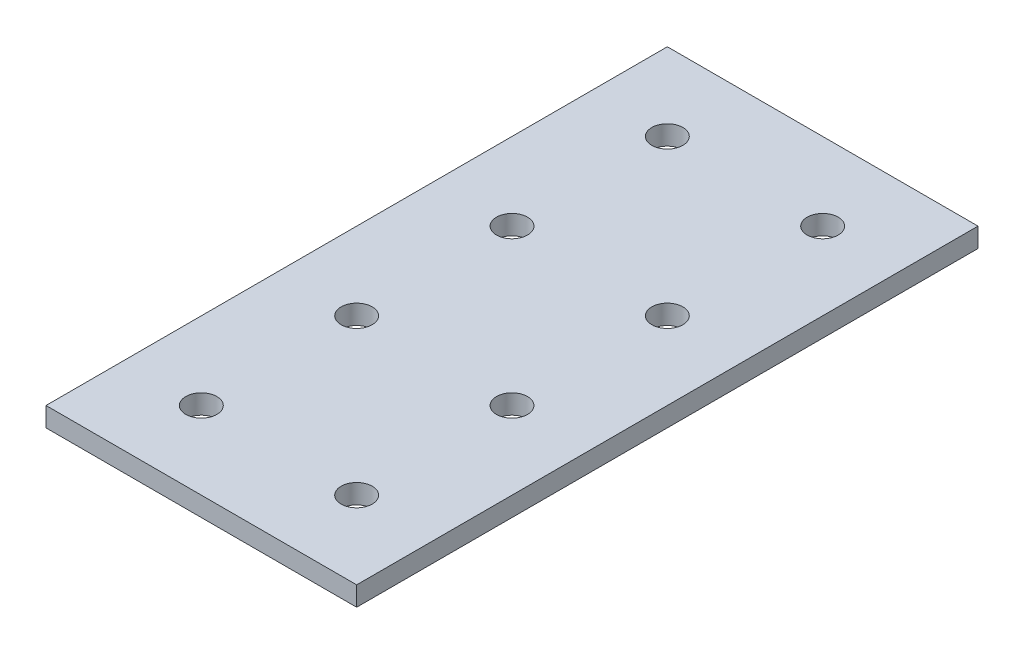
ISO-10303-21;
HEADER;
FILE_DESCRIPTION(('STEP AP214'),'2;1');
FILE_NAME('part.step','',(''),(''),'','','');
FILE_SCHEMA(('AUTOMOTIVE_DESIGN { 1 0 10303 214 1 1 1 1 }'));
ENDSEC;
DATA;
#1=APPLICATION_CONTEXT('core data for automotive mechanical design processes');
#2=APPLICATION_PROTOCOL_DEFINITION('international standard','automotive_design',2000,#1);
#3=PRODUCT_CONTEXT('',#1,'mechanical');
#4=PRODUCT('Part','Part','',(#3));
#5=PRODUCT_RELATED_PRODUCT_CATEGORY('part','',(#4));
#6=PRODUCT_DEFINITION_FORMATION('','',#4);
#7=PRODUCT_DEFINITION_CONTEXT('part definition',#1,'design');
#8=PRODUCT_DEFINITION('design','',#6,#7);
#9=PRODUCT_DEFINITION_SHAPE('','',#8);
#10=(LENGTH_UNIT() NAMED_UNIT(*) SI_UNIT(.MILLI.,.METRE.));
#11=(NAMED_UNIT(*) PLANE_ANGLE_UNIT() SI_UNIT($,.RADIAN.));
#12=(NAMED_UNIT(*) SI_UNIT($,.STERADIAN.) SOLID_ANGLE_UNIT());
#13=UNCERTAINTY_MEASURE_WITH_UNIT(LENGTH_MEASURE(1.E-05),#10,'distance_accuracy_value','');
#14=(GEOMETRIC_REPRESENTATION_CONTEXT(3) GLOBAL_UNCERTAINTY_ASSIGNED_CONTEXT((#13)) GLOBAL_UNIT_ASSIGNED_CONTEXT((#10,
#11,#12)) REPRESENTATION_CONTEXT('',''));
#15=CARTESIAN_POINT('',(0.,0.,0.));
#16=DIRECTION('',(0.,0.,1.));
#17=DIRECTION('',(1.,0.,0.));
#18=AXIS2_PLACEMENT_3D('',#15,#16,#17);
#19=CARTESIAN_POINT('',(-38.1,3.175,50.8));
#20=DIRECTION('',(1.,0.,0.));
#21=DIRECTION('',(0.,0.,-1.));
#22=AXIS2_PLACEMENT_3D('',#19,#20,#21);
#23=PLANE('',#22);
#24=DIRECTION('',(0.,0.,1.));
#25=VECTOR('',#24,1.);
#26=CARTESIAN_POINT('',(-38.1,0.,50.8));
#27=LINE('',#26,#25);
#28=CARTESIAN_POINT('',(-38.1,0.,-50.8));
#29=VERTEX_POINT('',#28);
#30=CARTESIAN_POINT('',(-38.1,0.,50.8));
#31=VERTEX_POINT('',#30);
#32=EDGE_CURVE('E106',#29,#31,#27,.T.);
#33=ORIENTED_EDGE('',*,*,#32,.T.);
#34=DIRECTION('',(0.,-1.,0.));
#35=VECTOR('',#34,1.);
#36=CARTESIAN_POINT('',(-38.1,3.175,50.8));
#37=LINE('',#36,#35);
#38=CARTESIAN_POINT('',(-38.1,3.175,50.8));
#39=VERTEX_POINT('',#38);
#40=EDGE_CURVE('E11',#39,#31,#37,.T.);
#41=ORIENTED_EDGE('',*,*,#40,.F.);
#42=DIRECTION('',(0.,0.,1.));
#43=VECTOR('',#42,1.);
#44=CARTESIAN_POINT('',(-38.1,3.175,50.8));
#45=LINE('',#44,#43);
#46=CARTESIAN_POINT('',(-38.1,3.175,-50.8));
#47=VERTEX_POINT('',#46);
#48=EDGE_CURVE('E93',#47,#39,#45,.T.);
#49=ORIENTED_EDGE('',*,*,#48,.F.);
#50=DIRECTION('',(0.,-1.,0.));
#51=VECTOR('',#50,1.);
#52=CARTESIAN_POINT('',(-38.1,3.175,-50.8));
#53=LINE('',#52,#51);
#54=EDGE_CURVE('E102',#47,#29,#53,.T.);
#55=ORIENTED_EDGE('',*,*,#54,.T.);
#56=EDGE_LOOP('',(#33,#41,#49,#55));
#57=FACE_BOUND('',#56,.T.);
#58=ADVANCED_FACE('F43',(#57),#23,.F.);
#59=CARTESIAN_POINT('',(-38.1,3.175,50.8));
#60=DIRECTION('',(0.,0.,-1.));
#61=DIRECTION('',(-1.,0.,0.));
#62=AXIS2_PLACEMENT_3D('',#59,#60,#61);
#63=PLANE('',#62);
#64=DIRECTION('',(1.,0.,0.));
#65=VECTOR('',#64,1.);
#66=CARTESIAN_POINT('',(-38.1,0.,50.8));
#67=LINE('',#66,#65);
#68=CARTESIAN_POINT('',(12.7,0.,50.8));
#69=VERTEX_POINT('',#68);
#70=EDGE_CURVE('E98',#31,#69,#67,.T.);
#71=ORIENTED_EDGE('',*,*,#70,.T.);
#72=DIRECTION('',(0.,-1.,0.));
#73=VECTOR('',#72,1.);
#74=CARTESIAN_POINT('',(12.7,3.175,50.8));
#75=LINE('',#74,#73);
#76=CARTESIAN_POINT('',(12.7,3.175,50.8));
#77=VERTEX_POINT('',#76);
#78=EDGE_CURVE('E51',#77,#69,#75,.T.);
#79=ORIENTED_EDGE('',*,*,#78,.F.);
#80=DIRECTION('',(1.,0.,0.));
#81=VECTOR('',#80,1.);
#82=CARTESIAN_POINT('',(-38.1,3.175,50.8));
#83=LINE('',#82,#81);
#84=EDGE_CURVE('E88',#39,#77,#83,.T.);
#85=ORIENTED_EDGE('',*,*,#84,.F.);
#86=ORIENTED_EDGE('',*,*,#40,.T.);
#87=EDGE_LOOP('',(#71,#79,#85,#86));
#88=FACE_BOUND('',#87,.T.);
#89=ADVANCED_FACE('F97',(#88),#63,.F.);
#90=CARTESIAN_POINT('',(12.7,3.175,0.));
#91=DIRECTION('',(-1.,0.,0.));
#92=DIRECTION('',(0.,0.,1.));
#93=AXIS2_PLACEMENT_3D('',#90,#91,#92);
#94=PLANE('',#93);
#95=DIRECTION('',(0.,0.,-1.));
#96=VECTOR('',#95,1.);
#97=CARTESIAN_POINT('',(12.7,0.,0.));
#98=LINE('',#97,#96);
#99=CARTESIAN_POINT('',(12.7,0.,-50.8));
#100=VERTEX_POINT('',#99);
#101=EDGE_CURVE('E75',#69,#100,#98,.T.);
#102=ORIENTED_EDGE('',*,*,#101,.T.);
#103=DIRECTION('',(0.,-1.,0.));
#104=VECTOR('',#103,1.);
#105=CARTESIAN_POINT('',(12.7,3.175,-50.8));
#106=LINE('',#105,#104);
#107=CARTESIAN_POINT('',(12.7,3.175,-50.8));
#108=VERTEX_POINT('',#107);
#109=EDGE_CURVE('E99',#108,#100,#106,.T.);
#110=ORIENTED_EDGE('',*,*,#109,.F.);
#111=DIRECTION('',(0.,0.,-1.));
#112=VECTOR('',#111,1.);
#113=CARTESIAN_POINT('',(12.7,3.175,0.));
#114=LINE('',#113,#112);
#115=EDGE_CURVE('E91',#77,#108,#114,.T.);
#116=ORIENTED_EDGE('',*,*,#115,.F.);
#117=ORIENTED_EDGE('',*,*,#78,.T.);
#118=EDGE_LOOP('',(#102,#110,#116,#117));
#119=FACE_BOUND('',#118,.T.);
#120=ADVANCED_FACE('F100',(#119),#94,.F.);
#121=CARTESIAN_POINT('',(-38.1,3.175,-50.8));
#122=DIRECTION('',(0.,0.,1.));
#123=DIRECTION('',(1.,0.,0.));
#124=AXIS2_PLACEMENT_3D('',#121,#122,#123);
#125=PLANE('',#124);
#126=DIRECTION('',(-1.,0.,0.));
#127=VECTOR('',#126,1.);
#128=CARTESIAN_POINT('',(-38.1,0.,-50.8));
#129=LINE('',#128,#127);
#130=EDGE_CURVE('E81',#100,#29,#129,.T.);
#131=ORIENTED_EDGE('',*,*,#130,.T.);
#132=ORIENTED_EDGE('',*,*,#54,.F.);
#133=DIRECTION('',(-1.,0.,0.));
#134=VECTOR('',#133,1.);
#135=CARTESIAN_POINT('',(-38.1,3.175,-50.8));
#136=LINE('',#135,#134);
#137=EDGE_CURVE('E59',#108,#47,#136,.T.);
#138=ORIENTED_EDGE('',*,*,#137,.F.);
#139=ORIENTED_EDGE('',*,*,#109,.T.);
#140=EDGE_LOOP('',(#131,#132,#138,#139));
#141=FACE_BOUND('',#140,.T.);
#142=ADVANCED_FACE('F114',(#141),#125,.F.);
#143=CARTESIAN_POINT('',(0.,3.175,0.));
#144=DIRECTION('',(0.,-1.,0.));
#145=DIRECTION('',(0.,0.,-1.));
#146=AXIS2_PLACEMENT_3D('',#143,#144,#145);
#147=PLANE('',#146);
#148=CARTESIAN_POINT('',(0.,3.175,-12.7));
#149=DIRECTION('',(0.,1.,0.));
#150=DIRECTION('',(0.,0.,1.));
#151=AXIS2_PLACEMENT_3D('',#148,#149,#150);
#152=CIRCLE('',#151,2.54);
#153=CARTESIAN_POINT('',(0.,3.175,-10.16));
#154=VERTEX_POINT('',#153);
#155=EDGE_CURVE('E138',#154,#154,#152,.T.);
#156=ORIENTED_EDGE('',*,*,#155,.F.);
#157=EDGE_LOOP('',(#156));
#158=FACE_BOUND('',#157,.T.);
#159=CARTESIAN_POINT('',(-25.4,3.175,38.1));
#160=DIRECTION('',(0.,1.,0.));
#161=DIRECTION('',(0.,0.,1.));
#162=AXIS2_PLACEMENT_3D('',#159,#160,#161);
#163=CIRCLE('',#162,2.54);
#164=CARTESIAN_POINT('',(-25.4,3.175,40.64));
#165=VERTEX_POINT('',#164);
#166=EDGE_CURVE('E133',#165,#165,#163,.T.);
#167=ORIENTED_EDGE('',*,*,#166,.F.);
#168=EDGE_LOOP('',(#167));
#169=FACE_BOUND('',#168,.T.);
#170=CARTESIAN_POINT('',(-25.4,3.175,12.7));
#171=DIRECTION('',(0.,1.,0.));
#172=DIRECTION('',(0.,0.,1.));
#173=AXIS2_PLACEMENT_3D('',#170,#171,#172);
#174=CIRCLE('',#173,2.54);
#175=CARTESIAN_POINT('',(-25.4,3.175,15.24));
#176=VERTEX_POINT('',#175);
#177=EDGE_CURVE('E126',#176,#176,#174,.T.);
#178=ORIENTED_EDGE('',*,*,#177,.F.);
#179=EDGE_LOOP('',(#178));
#180=FACE_BOUND('',#179,.T.);
#181=CARTESIAN_POINT('',(-25.4,3.175,-12.7));
#182=DIRECTION('',(0.,1.,0.));
#183=DIRECTION('',(0.,0.,1.));
#184=AXIS2_PLACEMENT_3D('',#181,#182,#183);
#185=CIRCLE('',#184,2.54);
#186=CARTESIAN_POINT('',(-25.4,3.175,-10.16));
#187=VERTEX_POINT('',#186);
#188=EDGE_CURVE('E125',#187,#187,#185,.T.);
#189=ORIENTED_EDGE('',*,*,#188,.F.);
#190=EDGE_LOOP('',(#189));
#191=FACE_BOUND('',#190,.T.);
#192=CARTESIAN_POINT('',(0.,3.175,12.7));
#193=DIRECTION('',(0.,1.,0.));
#194=DIRECTION('',(0.,0.,1.));
#195=AXIS2_PLACEMENT_3D('',#192,#193,#194);
#196=CIRCLE('',#195,2.54);
#197=CARTESIAN_POINT('',(0.,3.175,15.24));
#198=VERTEX_POINT('',#197);
#199=EDGE_CURVE('E145',#198,#198,#196,.T.);
#200=ORIENTED_EDGE('',*,*,#199,.F.);
#201=EDGE_LOOP('',(#200));
#202=FACE_BOUND('',#201,.T.);
#203=CARTESIAN_POINT('',(0.,3.175,38.1));
#204=DIRECTION('',(0.,1.,0.));
#205=DIRECTION('',(0.,0.,1.));
#206=AXIS2_PLACEMENT_3D('',#203,#204,#205);
#207=CIRCLE('',#206,2.54);
#208=CARTESIAN_POINT('',(0.,3.175,40.64));
#209=VERTEX_POINT('',#208);
#210=EDGE_CURVE('E157',#209,#209,#207,.T.);
#211=ORIENTED_EDGE('',*,*,#210,.F.);
#212=EDGE_LOOP('',(#211));
#213=FACE_BOUND('',#212,.T.);
#214=CARTESIAN_POINT('',(0.,3.175,-38.1));
#215=DIRECTION('',(0.,1.,0.));
#216=DIRECTION('',(0.,0.,1.));
#217=AXIS2_PLACEMENT_3D('',#214,#215,#216);
#218=CIRCLE('',#217,2.54);
#219=CARTESIAN_POINT('',(0.,3.175,-35.56));
#220=VERTEX_POINT('',#219);
#221=EDGE_CURVE('E150',#220,#220,#218,.T.);
#222=ORIENTED_EDGE('',*,*,#221,.F.);
#223=EDGE_LOOP('',(#222));
#224=FACE_BOUND('',#223,.T.);
#225=CARTESIAN_POINT('',(-25.4,3.175,-38.1));
#226=DIRECTION('',(0.,1.,0.));
#227=DIRECTION('',(0.,0.,1.));
#228=AXIS2_PLACEMENT_3D('',#225,#226,#227);
#229=CIRCLE('',#228,2.54);
#230=CARTESIAN_POINT('',(-25.4,3.175,-35.56));
#231=VERTEX_POINT('',#230);
#232=EDGE_CURVE('E122',#231,#231,#229,.T.);
#233=ORIENTED_EDGE('',*,*,#232,.F.);
#234=EDGE_LOOP('',(#233));
#235=FACE_BOUND('',#234,.T.);
#236=ORIENTED_EDGE('',*,*,#48,.T.);
#237=ORIENTED_EDGE('',*,*,#84,.T.);
#238=ORIENTED_EDGE('',*,*,#115,.T.);
#239=ORIENTED_EDGE('',*,*,#137,.T.);
#240=EDGE_LOOP('',(#236,#237,#238,#239));
#241=FACE_BOUND('',#240,.T.);
#242=ADVANCED_FACE('F89',(#158,#169,#180,#191,#202,#213,#224,#235,#241),#147,.F.);
#243=CARTESIAN_POINT('',(0.,0.,0.));
#244=DIRECTION('',(0.,-1.,0.));
#245=DIRECTION('',(0.,0.,-1.));
#246=AXIS2_PLACEMENT_3D('',#243,#244,#245);
#247=PLANE('',#246);
#248=CARTESIAN_POINT('',(0.,0.,-12.7));
#249=DIRECTION('',(0.,-1.,0.));
#250=DIRECTION('',(0.,0.,-1.));
#251=AXIS2_PLACEMENT_3D('',#248,#249,#250);
#252=CIRCLE('',#251,2.54);
#253=CARTESIAN_POINT('',(0.,0.,-15.24));
#254=VERTEX_POINT('',#253);
#255=EDGE_CURVE('E142',#254,#254,#252,.F.);
#256=ORIENTED_EDGE('',*,*,#255,.T.);
#257=EDGE_LOOP('',(#256));
#258=FACE_BOUND('',#257,.T.);
#259=CARTESIAN_POINT('',(-25.4,0.,38.1));
#260=DIRECTION('',(0.,-1.,0.));
#261=DIRECTION('',(0.,0.,-1.));
#262=AXIS2_PLACEMENT_3D('',#259,#260,#261);
#263=CIRCLE('',#262,2.54);
#264=CARTESIAN_POINT('',(-25.4,0.,35.56));
#265=VERTEX_POINT('',#264);
#266=EDGE_CURVE('E141',#265,#265,#263,.F.);
#267=ORIENTED_EDGE('',*,*,#266,.T.);
#268=EDGE_LOOP('',(#267));
#269=FACE_BOUND('',#268,.T.);
#270=CARTESIAN_POINT('',(-25.4,0.,12.7));
#271=DIRECTION('',(0.,-1.,0.));
#272=DIRECTION('',(0.,0.,-1.));
#273=AXIS2_PLACEMENT_3D('',#270,#271,#272);
#274=CIRCLE('',#273,2.54);
#275=CARTESIAN_POINT('',(-25.4,0.,10.16));
#276=VERTEX_POINT('',#275);
#277=EDGE_CURVE('E130',#276,#276,#274,.F.);
#278=ORIENTED_EDGE('',*,*,#277,.T.);
#279=EDGE_LOOP('',(#278));
#280=FACE_BOUND('',#279,.T.);
#281=CARTESIAN_POINT('',(-25.4,0.,-12.7));
#282=DIRECTION('',(0.,-1.,0.));
#283=DIRECTION('',(0.,0.,-1.));
#284=AXIS2_PLACEMENT_3D('',#281,#282,#283);
#285=CIRCLE('',#284,2.54);
#286=CARTESIAN_POINT('',(-25.4,0.,-15.24));
#287=VERTEX_POINT('',#286);
#288=EDGE_CURVE('E129',#287,#287,#285,.F.);
#289=ORIENTED_EDGE('',*,*,#288,.T.);
#290=EDGE_LOOP('',(#289));
#291=FACE_BOUND('',#290,.T.);
#292=CARTESIAN_POINT('',(0.,0.,12.7));
#293=DIRECTION('',(0.,-1.,0.));
#294=DIRECTION('',(0.,0.,-1.));
#295=AXIS2_PLACEMENT_3D('',#292,#293,#294);
#296=CIRCLE('',#295,2.54);
#297=CARTESIAN_POINT('',(0.,0.,10.16));
#298=VERTEX_POINT('',#297);
#299=EDGE_CURVE('E160',#298,#298,#296,.F.);
#300=ORIENTED_EDGE('',*,*,#299,.T.);
#301=EDGE_LOOP('',(#300));
#302=FACE_BOUND('',#301,.T.);
#303=CARTESIAN_POINT('',(0.,0.,38.1));
#304=DIRECTION('',(0.,-1.,0.));
#305=DIRECTION('',(0.,0.,-1.));
#306=AXIS2_PLACEMENT_3D('',#303,#304,#305);
#307=CIRCLE('',#306,2.54);
#308=CARTESIAN_POINT('',(0.,0.,35.56));
#309=VERTEX_POINT('',#308);
#310=EDGE_CURVE('E153',#309,#309,#307,.F.);
#311=ORIENTED_EDGE('',*,*,#310,.T.);
#312=EDGE_LOOP('',(#311));
#313=FACE_BOUND('',#312,.T.);
#314=CARTESIAN_POINT('',(0.,0.,-38.1));
#315=DIRECTION('',(0.,-1.,0.));
#316=DIRECTION('',(0.,0.,-1.));
#317=AXIS2_PLACEMENT_3D('',#314,#315,#316);
#318=CIRCLE('',#317,2.54);
#319=CARTESIAN_POINT('',(0.,0.,-40.64));
#320=VERTEX_POINT('',#319);
#321=EDGE_CURVE('E154',#320,#320,#318,.F.);
#322=ORIENTED_EDGE('',*,*,#321,.T.);
#323=EDGE_LOOP('',(#322));
#324=FACE_BOUND('',#323,.T.);
#325=CARTESIAN_POINT('',(-25.4,0.,-38.1));
#326=DIRECTION('',(0.,-1.,0.));
#327=DIRECTION('',(0.,0.,-1.));
#328=AXIS2_PLACEMENT_3D('',#325,#326,#327);
#329=CIRCLE('',#328,2.54);
#330=CARTESIAN_POINT('',(-25.4,0.,-40.64));
#331=VERTEX_POINT('',#330);
#332=EDGE_CURVE('E109',#331,#331,#329,.F.);
#333=ORIENTED_EDGE('',*,*,#332,.T.);
#334=EDGE_LOOP('',(#333));
#335=FACE_BOUND('',#334,.T.);
#336=ORIENTED_EDGE('',*,*,#32,.F.);
#337=ORIENTED_EDGE('',*,*,#130,.F.);
#338=ORIENTED_EDGE('',*,*,#101,.F.);
#339=ORIENTED_EDGE('',*,*,#70,.F.);
#340=EDGE_LOOP('',(#336,#337,#338,#339));
#341=FACE_BOUND('',#340,.T.);
#342=ADVANCED_FACE('F117',(#258,#269,#280,#291,#302,#313,#324,#335,#341),#247,.T.);
#343=CARTESIAN_POINT('',(-25.4,-7.18420489685533,-38.1));
#344=DIRECTION('',(0.,1.,0.));
#345=DIRECTION('',(0.,0.,1.));
#346=AXIS2_PLACEMENT_3D('',#343,#344,#345);
#347=CYLINDRICAL_SURFACE('',#346,2.54);
#348=ORIENTED_EDGE('',*,*,#232,.T.);
#349=EDGE_LOOP('',(#348));
#350=FACE_BOUND('',#349,.T.);
#351=ORIENTED_EDGE('',*,*,#332,.F.);
#352=EDGE_LOOP('',(#351));
#353=FACE_BOUND('',#352,.T.);
#354=ADVANCED_FACE('F199',(#350,#353),#347,.F.);
#355=CARTESIAN_POINT('',(0.,-7.18420489685533,-38.1));
#356=DIRECTION('',(0.,1.,0.));
#357=DIRECTION('',(0.,0.,1.));
#358=AXIS2_PLACEMENT_3D('',#355,#356,#357);
#359=CYLINDRICAL_SURFACE('',#358,2.54);
#360=ORIENTED_EDGE('',*,*,#221,.T.);
#361=EDGE_LOOP('',(#360));
#362=FACE_BOUND('',#361,.T.);
#363=ORIENTED_EDGE('',*,*,#321,.F.);
#364=EDGE_LOOP('',(#363));
#365=FACE_BOUND('',#364,.T.);
#366=ADVANCED_FACE('F183',(#362,#365),#359,.F.);
#367=CARTESIAN_POINT('',(0.,-7.18420489685533,38.1));
#368=DIRECTION('',(0.,1.,0.));
#369=DIRECTION('',(0.,0.,1.));
#370=AXIS2_PLACEMENT_3D('',#367,#368,#369);
#371=CYLINDRICAL_SURFACE('',#370,2.54);
#372=ORIENTED_EDGE('',*,*,#210,.T.);
#373=EDGE_LOOP('',(#372));
#374=FACE_BOUND('',#373,.T.);
#375=ORIENTED_EDGE('',*,*,#310,.F.);
#376=EDGE_LOOP('',(#375));
#377=FACE_BOUND('',#376,.T.);
#378=ADVANCED_FACE('F173',(#374,#377),#371,.F.);
#379=CARTESIAN_POINT('',(0.,-7.18420489685533,12.7));
#380=DIRECTION('',(0.,1.,0.));
#381=DIRECTION('',(0.,0.,1.));
#382=AXIS2_PLACEMENT_3D('',#379,#380,#381);
#383=CYLINDRICAL_SURFACE('',#382,2.54);
#384=ORIENTED_EDGE('',*,*,#199,.T.);
#385=EDGE_LOOP('',(#384));
#386=FACE_BOUND('',#385,.T.);
#387=ORIENTED_EDGE('',*,*,#299,.F.);
#388=EDGE_LOOP('',(#387));
#389=FACE_BOUND('',#388,.T.);
#390=ADVANCED_FACE('F170',(#386,#389),#383,.F.);
#391=CARTESIAN_POINT('',(-25.4,-7.18420489685533,-12.7));
#392=DIRECTION('',(0.,1.,0.));
#393=DIRECTION('',(0.,0.,1.));
#394=AXIS2_PLACEMENT_3D('',#391,#392,#393);
#395=CYLINDRICAL_SURFACE('',#394,2.54);
#396=ORIENTED_EDGE('',*,*,#188,.T.);
#397=EDGE_LOOP('',(#396));
#398=FACE_BOUND('',#397,.T.);
#399=ORIENTED_EDGE('',*,*,#288,.F.);
#400=EDGE_LOOP('',(#399));
#401=FACE_BOUND('',#400,.T.);
#402=ADVANCED_FACE('F172',(#398,#401),#395,.F.);
#403=CARTESIAN_POINT('',(-25.4,-7.18420489685533,12.7));
#404=DIRECTION('',(0.,1.,0.));
#405=DIRECTION('',(0.,0.,1.));
#406=AXIS2_PLACEMENT_3D('',#403,#404,#405);
#407=CYLINDRICAL_SURFACE('',#406,2.54);
#408=ORIENTED_EDGE('',*,*,#177,.T.);
#409=EDGE_LOOP('',(#408));
#410=FACE_BOUND('',#409,.T.);
#411=ORIENTED_EDGE('',*,*,#277,.F.);
#412=EDGE_LOOP('',(#411));
#413=FACE_BOUND('',#412,.T.);
#414=ADVANCED_FACE('F180',(#410,#413),#407,.F.);
#415=CARTESIAN_POINT('',(-25.4,-7.18420489685533,38.1));
#416=DIRECTION('',(0.,1.,0.));
#417=DIRECTION('',(0.,0.,1.));
#418=AXIS2_PLACEMENT_3D('',#415,#416,#417);
#419=CYLINDRICAL_SURFACE('',#418,2.54);
#420=ORIENTED_EDGE('',*,*,#166,.T.);
#421=EDGE_LOOP('',(#420));
#422=FACE_BOUND('',#421,.T.);
#423=ORIENTED_EDGE('',*,*,#266,.F.);
#424=EDGE_LOOP('',(#423));
#425=FACE_BOUND('',#424,.T.);
#426=ADVANCED_FACE('F208',(#422,#425),#419,.F.);
#427=CARTESIAN_POINT('',(0.,-7.18420489685533,-12.7));
#428=DIRECTION('',(0.,1.,0.));
#429=DIRECTION('',(0.,0.,1.));
#430=AXIS2_PLACEMENT_3D('',#427,#428,#429);
#431=CYLINDRICAL_SURFACE('',#430,2.54);
#432=ORIENTED_EDGE('',*,*,#155,.T.);
#433=EDGE_LOOP('',(#432));
#434=FACE_BOUND('',#433,.T.);
#435=ORIENTED_EDGE('',*,*,#255,.F.);
#436=EDGE_LOOP('',(#435));
#437=FACE_BOUND('',#436,.T.);
#438=ADVANCED_FACE('F211',(#434,#437),#431,.F.);
#439=CLOSED_SHELL('',(#58,#89,#120,#142,#242,#342,#354,#366,#378,#390,#402,#414,#426,#438));
#440=MANIFOLD_SOLID_BREP('B2',#439);
#441=ADVANCED_BREP_SHAPE_REPRESENTATION('',(#18,#440),#14);
#442=SHAPE_DEFINITION_REPRESENTATION(#9,#441);
ENDSEC;
END-ISO-10303-21;
